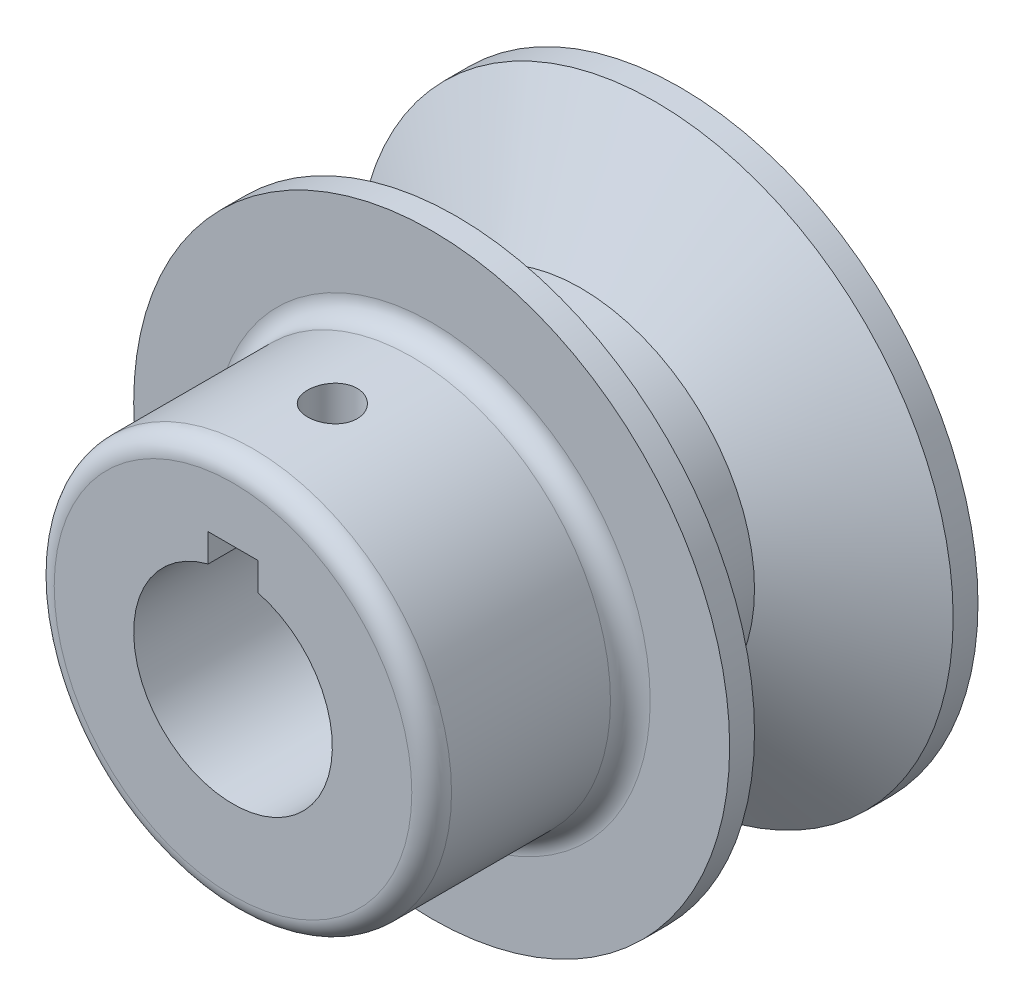
ISO-10303-21;
HEADER;
FILE_DESCRIPTION(('STEP AP214'),'2;1');
FILE_NAME('part.step','',(''),(''),'','','');
FILE_SCHEMA(('AUTOMOTIVE_DESIGN { 1 0 10303 214 1 1 1 1 }'));
ENDSEC;
DATA;
#1=APPLICATION_CONTEXT('core data for automotive mechanical design processes');
#2=APPLICATION_PROTOCOL_DEFINITION('international standard','automotive_design',2000,#1);
#3=PRODUCT_CONTEXT('',#1,'mechanical');
#4=PRODUCT('Part','Part','',(#3));
#5=PRODUCT_RELATED_PRODUCT_CATEGORY('part','',(#4));
#6=PRODUCT_DEFINITION_FORMATION('','',#4);
#7=PRODUCT_DEFINITION_CONTEXT('part definition',#1,'design');
#8=PRODUCT_DEFINITION('design','',#6,#7);
#9=PRODUCT_DEFINITION_SHAPE('','',#8);
#10=(LENGTH_UNIT() NAMED_UNIT(*) SI_UNIT(.MILLI.,.METRE.));
#11=(NAMED_UNIT(*) PLANE_ANGLE_UNIT() SI_UNIT($,.RADIAN.));
#12=(NAMED_UNIT(*) SI_UNIT($,.STERADIAN.) SOLID_ANGLE_UNIT());
#13=UNCERTAINTY_MEASURE_WITH_UNIT(LENGTH_MEASURE(1.E-05),#10,'distance_accuracy_value','');
#14=(GEOMETRIC_REPRESENTATION_CONTEXT(3) GLOBAL_UNCERTAINTY_ASSIGNED_CONTEXT((#13)) GLOBAL_UNIT_ASSIGNED_CONTEXT((#10,
#11,#12)) REPRESENTATION_CONTEXT('',''));
#15=CARTESIAN_POINT('',(0.,0.,0.));
#16=DIRECTION('',(0.,0.,1.));
#17=DIRECTION('',(1.,0.,0.));
#18=AXIS2_PLACEMENT_3D('',#15,#16,#17);
#19=CARTESIAN_POINT('',(0.,0.,0.));
#20=DIRECTION('',(0.,0.,1.));
#21=DIRECTION('',(1.,0.,0.));
#22=AXIS2_PLACEMENT_3D('',#19,#20,#21);
#23=CYLINDRICAL_SURFACE('',#22,12.7);
#24=CARTESIAN_POINT('',(0.,0.,-11.43));
#25=DIRECTION('',(0.,0.,-1.));
#26=DIRECTION('',(-1.,0.,0.));
#27=AXIS2_PLACEMENT_3D('',#24,#25,#26);
#28=CIRCLE('',#27,12.7);
#29=CARTESIAN_POINT('',(-12.7,0.,-11.43));
#30=VERTEX_POINT('',#29);
#31=EDGE_CURVE('E140',#30,#30,#28,.F.);
#32=ORIENTED_EDGE('',*,*,#31,.T.);
#33=EDGE_LOOP('',(#32));
#34=FACE_BOUND('',#33,.T.);
#35=CARTESIAN_POINT('',(0.,0.,-1.27));
#36=DIRECTION('',(0.,0.,-1.));
#37=DIRECTION('',(-1.,0.,0.));
#38=AXIS2_PLACEMENT_3D('',#35,#36,#37);
#39=CIRCLE('',#38,12.7);
#40=CARTESIAN_POINT('',(-12.7,0.,-1.27));
#41=VERTEX_POINT('',#40);
#42=EDGE_CURVE('E94',#41,#41,#39,.T.);
#43=ORIENTED_EDGE('',*,*,#42,.T.);
#44=EDGE_LOOP('',(#43));
#45=FACE_BOUND('',#44,.T.);
#46=CARTESIAN_POINT('',(0.,12.7,-7.9375));
#47=CARTESIAN_POINT('',(-0.0887990956779086,12.6999987610923,-7.93749622750582));
#48=CARTESIAN_POINT('',(-0.177653679682245,12.6990588319236,-7.93002422172751));
#49=CARTESIAN_POINT('',(-0.352890329326993,12.6953996797071,-7.90033487584755));
#50=CARTESIAN_POINT('',(-0.439269714946078,12.6926785988531,-7.87810213941865));
#51=CARTESIAN_POINT('',(-0.60699369000629,12.685763687632,-7.81955659611456));
#52=CARTESIAN_POINT('',(-0.688341625692798,12.6815708487427,-7.78325326645074));
#53=CARTESIAN_POINT('',(-0.843774966557078,12.6721787505759,-7.69761777467918));
#54=CARTESIAN_POINT('',(-0.917861614588296,12.6669796639841,-7.648287847583));
#55=CARTESIAN_POINT('',(-1.05709263875139,12.6561235402952,-7.53770911185186));
#56=CARTESIAN_POINT('',(-1.12219128173507,12.6504643782968,-7.47640292286514));
#57=CARTESIAN_POINT('',(-1.24120452390901,12.6393430601619,-7.34373510705423));
#58=CARTESIAN_POINT('',(-1.29511855300908,12.6338809140791,-7.27237296798009));
#59=CARTESIAN_POINT('',(-1.3904024524153,12.6237511406844,-7.1213218142458));
#60=CARTESIAN_POINT('',(-1.43172948092258,12.6190862500797,-7.04160557540436));
#61=CARTESIAN_POINT('',(-1.5003926536252,12.6111071657063,-6.87629622201343));
#62=CARTESIAN_POINT('',(-1.52772932837141,12.6077929207184,-6.79070333046165));
#63=CARTESIAN_POINT('',(-1.56749685231573,12.6029106564829,-6.6165449358024));
#64=CARTESIAN_POINT('',(-1.58000491385463,12.6013335948233,-6.52799732135784));
#65=CARTESIAN_POINT('',(-1.58999907396884,12.6000765787067,-6.35004682269539));
#66=CARTESIAN_POINT('',(-1.58748577663654,12.6003965479596,-6.26064397301563));
#67=CARTESIAN_POINT('',(-1.56757194514442,12.6028891665979,-6.08405893469702));
#68=CARTESIAN_POINT('',(-1.55025646449528,12.6050512310481,-5.99686698376283));
#69=CARTESIAN_POINT('',(-1.5013624933206,12.6109679184609,-5.82663616152594));
#70=CARTESIAN_POINT('',(-1.46978371381246,12.6147225736903,-5.74359737440658));
#71=CARTESIAN_POINT('',(-1.3931681305439,12.6234133857405,-5.58376582062123));
#72=CARTESIAN_POINT('',(-1.34809436610435,12.6283527798927,-5.50699095434189));
#73=CARTESIAN_POINT('',(-1.24579473310514,12.6388540175843,-5.36206274904759));
#74=CARTESIAN_POINT('',(-1.18856830871129,12.644415889589,-5.29390980460671));
#75=CARTESIAN_POINT('',(-1.06311643532865,12.6555824478042,-5.16766637869106));
#76=CARTESIAN_POINT('',(-0.994817674978408,12.6611871641568,-5.1096487267286));
#77=CARTESIAN_POINT('',(-0.849412302387342,12.6717719167297,-5.0058898611806));
#78=CARTESIAN_POINT('',(-0.77230566983709,12.6767519515096,-4.96014867590328));
#79=CARTESIAN_POINT('',(-0.61141716131581,12.685529316588,-4.88224111150541));
#80=CARTESIAN_POINT('',(-0.52763305403945,12.6893262494498,-4.85007929278542));
#81=CARTESIAN_POINT('',(-0.355795542173721,12.6953059897034,-4.80030123661273));
#82=CARTESIAN_POINT('',(-0.267742337660474,12.6974888726618,-4.78268431819297));
#83=CARTESIAN_POINT('',(-0.0904958590850711,12.6999847372083,-4.76259053559455));
#84=CARTESIAN_POINT('',(-0.00131412627611589,12.7003101095057,-4.76001334484882));
#85=CARTESIAN_POINT('',(0.17620998317591,12.6990877463345,-4.76980741112553));
#86=CARTESIAN_POINT('',(0.264552377653589,12.6975400507556,-4.78217834980476));
#87=CARTESIAN_POINT('',(0.437594062403167,12.692753181605,-4.82143416507173));
#88=CARTESIAN_POINT('',(0.522304372219688,12.6895195841681,-4.84827120476067));
#89=CARTESIAN_POINT('',(0.686022030835089,12.6817229416863,-4.9156476819647));
#90=CARTESIAN_POINT('',(0.765029185880475,12.677159851501,-4.95618758474205));
#91=CARTESIAN_POINT('',(0.915545870636516,12.6671820754792,-5.05006174231724));
#92=CARTESIAN_POINT('',(0.987014637564325,12.6617631196699,-5.10346089402658));
#93=CARTESIAN_POINT('',(1.12001108841271,12.6506931537679,-5.22144593093422));
#94=CARTESIAN_POINT('',(1.18153837754391,12.6450421344708,-5.28603226017938));
#95=CARTESIAN_POINT('',(1.29326129384944,12.6341067196874,-5.42500020964078));
#96=CARTESIAN_POINT('',(1.34339041746064,12.6288245944804,-5.4994354999071));
#97=CARTESIAN_POINT('',(1.43043458479663,12.6192623600859,-5.65572798548274));
#98=CARTESIAN_POINT('',(1.46734989341751,12.614982230812,-5.73758503196759));
#99=CARTESIAN_POINT('',(1.52681087758025,12.6079240499955,-5.90618282765873));
#100=CARTESIAN_POINT('',(1.54939404843526,12.6051420819234,-5.99291018208046));
#101=CARTESIAN_POINT('',(1.57967044610608,12.6013839660123,-6.16896307720072));
#102=CARTESIAN_POINT('',(1.58736436561021,12.6004077341657,-6.25828849683397));
#103=CARTESIAN_POINT('',(1.58763115041387,12.6003740688386,-6.43634027004497));
#104=CARTESIAN_POINT('',(1.58030849653904,12.6013033771749,-6.52506648269075));
#105=CARTESIAN_POINT('',(1.55097124707932,12.6049475773112,-6.70001652713412));
#106=CARTESIAN_POINT('',(1.52895664992016,12.6076624693026,-6.78624035866358));
#107=CARTESIAN_POINT('',(1.47089309179293,12.6145678351684,-6.95372431754666));
#108=CARTESIAN_POINT('',(1.43484916291654,12.6187577799142,-7.03498621258885));
#109=CARTESIAN_POINT('',(1.34976038286545,12.6281420236046,-7.19032512532068));
#110=CARTESIAN_POINT('',(1.30071536878859,12.6333363351336,-7.26440205296759));
#111=CARTESIAN_POINT('',(1.19062902035381,12.6441873401767,-7.4038023280912));
#112=CARTESIAN_POINT('',(1.1295098223671,12.6498468877336,-7.46906396770641));
#113=CARTESIAN_POINT('',(0.997172394124923,12.6609654806149,-7.58844483398166));
#114=CARTESIAN_POINT('',(0.925951786104895,12.66642447835,-7.64256142984169));
#115=CARTESIAN_POINT('',(0.775122669242424,12.6765498093258,-7.73829120176186));
#116=CARTESIAN_POINT('',(0.695483292543568,12.6812130492472,-7.77985604674603));
#117=CARTESIAN_POINT('',(0.530341142961313,12.6891900716372,-7.84896273925184));
#118=CARTESIAN_POINT('',(0.4448448563526,12.6925053195968,-7.87651982373445));
#119=CARTESIAN_POINT('',(0.299088665199632,12.6966136740812,-7.91023267973878));
#120=CARTESIAN_POINT('',(0.239747846333245,12.6978773594361,-7.92044322815861));
#121=CARTESIAN_POINT('',(0.120279835139896,12.6995709389403,-7.9340781410152));
#122=CARTESIAN_POINT('',(0.0601526486149773,12.700000839238,-7.93750255549356));
#123=CARTESIAN_POINT('',(0.,12.7,-7.9375));
#124=B_SPLINE_CURVE_WITH_KNOTS('',3,(#46,#47,#48,#49,#50,#51,#52,#53,#54,#55,#56,#57,#58,#59,
#60,#61,#62,#63,#64,#65,#66,#67,#68,#69,#70,#71,#72,#73,#74,#75,#76,#77,#78,#79,#80,#81,#82,#83,
#84,#85,#86,#87,#88,#89,#90,#91,#92,#93,#94,#95,#96,#97,#98,#99,#100,#101,#102,#103,#104,#105,
#106,#107,#108,#109,#110,#111,#112,#113,#114,#115,#116,#117,#118,#119,#120,#121,#122,#123),
.UNSPECIFIED.,.T.,.F.,(4,2,2,2,2,2,2,2,2,2,2,2,2,2,2,2,2,2,2,2,2,2,2,2,2,2,2,2,2,2,2,2,2,2,2,2,
2,2,4),(0.,0.266177568212917,0.532633212699076,0.798909697695424,1.06514052650331,
1.3326796638317,1.60023243453007,1.86868593952482,2.13712926330472,2.40416858056814,
2.67119715876762,2.93670162240475,3.20221146555563,3.46845525691314,3.73471122826161,
4.00280808616625,4.27090556226827,4.53909300289569,4.80726788673901,5.0736517741387,
5.34002998858725,5.60553269222306,5.87104441155132,6.13792525859548,6.40481670123181,
6.67322751907309,6.94163295580677,7.20933327168387,7.47702113311746,7.74285282263406,
8.00868454063513,8.2744209968862,8.54016078294288,8.80767375934312,9.07524981028459,
9.34384340928402,9.61214421664361,9.79245465424144,9.97276376220778),.UNSPECIFIED.);
#125=CARTESIAN_POINT('',(0.,12.7,-7.9375));
#126=VERTEX_POINT('',#125);
#127=EDGE_CURVE('E160',#126,#126,#124,.T.);
#128=ORIENTED_EDGE('',*,*,#127,.F.);
#129=EDGE_LOOP('',(#128));
#130=FACE_BOUND('',#129,.T.);
#131=ADVANCED_FACE('F33',(#34,#45,#130),#23,.T.);
#132=CARTESIAN_POINT('',(1.5875,7.9375,-28.575));
#133=DIRECTION('',(0.,1.,0.));
#134=DIRECTION('',(0.,0.,1.));
#135=AXIS2_PLACEMENT_3D('',#132,#133,#134);
#136=PLANE('',#135);
#137=CARTESIAN_POINT('',(0.,7.9375,-6.35));
#138=DIRECTION('',(0.,1.,0.));
#139=DIRECTION('',(0.,0.,1.));
#140=AXIS2_PLACEMENT_3D('',#137,#138,#139);
#141=CIRCLE('',#140,1.5875);
#142=CARTESIAN_POINT('',(-1.5875,7.9375,-6.35));
#143=VERTEX_POINT('',#142);
#144=CARTESIAN_POINT('',(1.5875,7.9375,-6.35));
#145=VERTEX_POINT('',#144);
#146=EDGE_CURVE('E47',#143,#145,#141,.F.);
#147=ORIENTED_EDGE('',*,*,#146,.F.);
#148=DIRECTION('',(0.,0.,1.));
#149=VECTOR('',#148,1.);
#150=CARTESIAN_POINT('',(-1.5875,7.9375,-28.575));
#151=LINE('',#150,#149);
#152=CARTESIAN_POINT('',(-1.5875,7.9375,-28.575));
#153=VERTEX_POINT('',#152);
#154=EDGE_CURVE('E91',#153,#143,#151,.T.);
#155=ORIENTED_EDGE('',*,*,#154,.F.);
#156=DIRECTION('',(-1.,0.,0.));
#157=VECTOR('',#156,1.);
#158=CARTESIAN_POINT('',(1.5875,7.9375,-28.575));
#159=LINE('',#158,#157);
#160=CARTESIAN_POINT('',(1.5875,7.9375,-28.575));
#161=VERTEX_POINT('',#160);
#162=EDGE_CURVE('E226',#161,#153,#159,.T.);
#163=ORIENTED_EDGE('',*,*,#162,.F.);
#164=DIRECTION('',(0.,0.,1.));
#165=VECTOR('',#164,1.);
#166=CARTESIAN_POINT('',(1.5875,7.9375,-28.575));
#167=LINE('',#166,#165);
#168=EDGE_CURVE('E93',#161,#145,#167,.T.);
#169=ORIENTED_EDGE('',*,*,#168,.T.);
#170=EDGE_LOOP('',(#147,#155,#163,#169));
#171=FACE_BOUND('',#170,.T.);
#172=ADVANCED_FACE('F88',(#171),#136,.F.);
#173=EDGE_CURVE('E78',#145,#143,#141,.F.);
#174=ORIENTED_EDGE('',*,*,#173,.F.);
#175=CARTESIAN_POINT('',(1.5875,7.9375,0.));
#176=VERTEX_POINT('',#175);
#177=EDGE_CURVE('E114',#145,#176,#167,.T.);
#178=ORIENTED_EDGE('',*,*,#177,.T.);
#179=DIRECTION('',(-1.,0.,0.));
#180=VECTOR('',#179,1.);
#181=CARTESIAN_POINT('',(1.5875,7.9375,0.));
#182=LINE('',#181,#180);
#183=CARTESIAN_POINT('',(-1.5875,7.9375,0.));
#184=VERTEX_POINT('',#183);
#185=EDGE_CURVE('E99',#176,#184,#182,.T.);
#186=ORIENTED_EDGE('',*,*,#185,.T.);
#187=EDGE_CURVE('E96',#143,#184,#151,.T.);
#188=ORIENTED_EDGE('',*,*,#187,.F.);
#189=EDGE_LOOP('',(#174,#178,#186,#188));
#190=FACE_BOUND('',#189,.T.);
#191=ADVANCED_FACE('F97',(#190),#136,.F.);
#192=CARTESIAN_POINT('',(0.,12.7,0.));
#193=DIRECTION('',(0.,0.,-1.));
#194=DIRECTION('',(-1.,0.,0.));
#195=AXIS2_PLACEMENT_3D('',#192,#193,#194);
#196=PLANE('',#195);
#197=CARTESIAN_POINT('',(0.,0.,0.));
#198=DIRECTION('',(0.,0.,-1.));
#199=DIRECTION('',(-1.,0.,0.));
#200=AXIS2_PLACEMENT_3D('',#197,#198,#199);
#201=CIRCLE('',#200,11.43);
#202=CARTESIAN_POINT('',(-11.43,0.,0.));
#203=VERTEX_POINT('',#202);
#204=EDGE_CURVE('E11',#203,#203,#201,.F.);
#205=ORIENTED_EDGE('',*,*,#204,.T.);
#206=EDGE_LOOP('',(#205));
#207=FACE_BOUND('',#206,.T.);
#208=ORIENTED_EDGE('',*,*,#185,.F.);
#209=DIRECTION('',(0.,1.,0.));
#210=VECTOR('',#209,1.);
#211=CARTESIAN_POINT('',(1.5875,4.7625,0.));
#212=LINE('',#211,#210);
#213=CARTESIAN_POINT('',(1.5875,6.14836106210427,0.));
#214=VERTEX_POINT('',#213);
#215=EDGE_CURVE('E161',#214,#176,#212,.T.);
#216=ORIENTED_EDGE('',*,*,#215,.F.);
#217=CARTESIAN_POINT('',(0.,0.,0.));
#218=DIRECTION('',(0.,0.,1.));
#219=DIRECTION('',(1.,0.,0.));
#220=AXIS2_PLACEMENT_3D('',#217,#218,#219);
#221=CIRCLE('',#220,6.35);
#222=CARTESIAN_POINT('',(-1.5875,6.14836106210427,0.));
#223=VERTEX_POINT('',#222);
#224=EDGE_CURVE('E107',#223,#214,#221,.T.);
#225=ORIENTED_EDGE('',*,*,#224,.F.);
#226=DIRECTION('',(0.,-1.,0.));
#227=VECTOR('',#226,1.);
#228=CARTESIAN_POINT('',(-1.5875,4.7625,0.));
#229=LINE('',#228,#227);
#230=EDGE_CURVE('E112',#184,#223,#229,.T.);
#231=ORIENTED_EDGE('',*,*,#230,.F.);
#232=EDGE_LOOP('',(#208,#216,#225,#231));
#233=FACE_BOUND('',#232,.T.);
#234=ADVANCED_FACE('F213',(#207,#233),#196,.F.);
#235=CARTESIAN_POINT('',(0.,19.05,-12.7));
#236=DIRECTION('',(0.,0.,-1.));
#237=DIRECTION('',(-1.,0.,0.));
#238=AXIS2_PLACEMENT_3D('',#235,#236,#237);
#239=PLANE('',#238);
#240=CARTESIAN_POINT('',(0.,0.,-12.7));
#241=DIRECTION('',(0.,0.,-1.));
#242=DIRECTION('',(-1.,0.,0.));
#243=AXIS2_PLACEMENT_3D('',#240,#241,#242);
#244=CIRCLE('',#243,13.97);
#245=CARTESIAN_POINT('',(-13.97,0.,-12.7));
#246=VERTEX_POINT('',#245);
#247=EDGE_CURVE('E41',#246,#246,#244,.T.);
#248=ORIENTED_EDGE('',*,*,#247,.T.);
#249=EDGE_LOOP('',(#248));
#250=FACE_BOUND('',#249,.T.);
#251=CARTESIAN_POINT('',(0.,0.,-12.7));
#252=DIRECTION('',(0.,0.,1.));
#253=DIRECTION('',(1.,0.,0.));
#254=AXIS2_PLACEMENT_3D('',#251,#252,#253);
#255=CIRCLE('',#254,19.05);
#256=CARTESIAN_POINT('',(19.05,0.,-12.7));
#257=VERTEX_POINT('',#256);
#258=EDGE_CURVE('E133',#257,#257,#255,.T.);
#259=ORIENTED_EDGE('',*,*,#258,.T.);
#260=EDGE_LOOP('',(#259));
#261=FACE_BOUND('',#260,.T.);
#262=ADVANCED_FACE('F145',(#250,#261),#239,.F.);
#263=CARTESIAN_POINT('',(0.,0.,0.));
#264=DIRECTION('',(0.,0.,1.));
#265=DIRECTION('',(1.,0.,0.));
#266=AXIS2_PLACEMENT_3D('',#263,#264,#265);
#267=CYLINDRICAL_SURFACE('',#266,19.05);
#268=ORIENTED_EDGE('',*,*,#258,.F.);
#269=EDGE_LOOP('',(#268));
#270=FACE_BOUND('',#269,.T.);
#271=CARTESIAN_POINT('',(0.,0.,-14.2875));
#272=DIRECTION('',(0.,0.,1.));
#273=DIRECTION('',(1.,0.,0.));
#274=AXIS2_PLACEMENT_3D('',#271,#272,#273);
#275=CIRCLE('',#274,19.05);
#276=CARTESIAN_POINT('',(19.05,0.,-14.2875));
#277=VERTEX_POINT('',#276);
#278=EDGE_CURVE('E130',#277,#277,#275,.T.);
#279=ORIENTED_EDGE('',*,*,#278,.T.);
#280=EDGE_LOOP('',(#279));
#281=FACE_BOUND('',#280,.T.);
#282=ADVANCED_FACE('F208',(#270,#281),#267,.T.);
#283=CARTESIAN_POINT('',(0.,0.,-19.05));
#284=DIRECTION('',(0.,0.,1.));
#285=DIRECTION('',(1.,0.,0.));
#286=AXIS2_PLACEMENT_3D('',#283,#284,#285);
#287=CONICAL_SURFACE('',#286,11.1125,1.03037682652431);
#288=ORIENTED_EDGE('',*,*,#278,.F.);
#289=EDGE_LOOP('',(#288));
#290=FACE_BOUND('',#289,.T.);
#291=CARTESIAN_POINT('',(0.,0.,-19.05));
#292=DIRECTION('',(0.,0.,1.));
#293=DIRECTION('',(1.,0.,0.));
#294=AXIS2_PLACEMENT_3D('',#291,#292,#293);
#295=CIRCLE('',#294,11.1125);
#296=CARTESIAN_POINT('',(11.1125,0.,-19.05));
#297=VERTEX_POINT('',#296);
#298=EDGE_CURVE('E127',#297,#297,#295,.T.);
#299=ORIENTED_EDGE('',*,*,#298,.T.);
#300=EDGE_LOOP('',(#299));
#301=FACE_BOUND('',#300,.T.);
#302=ADVANCED_FACE('F204',(#290,#301),#287,.T.);
#303=CARTESIAN_POINT('',(0.,0.,0.));
#304=DIRECTION('',(0.,0.,1.));
#305=DIRECTION('',(1.,0.,0.));
#306=AXIS2_PLACEMENT_3D('',#303,#304,#305);
#307=CYLINDRICAL_SURFACE('',#306,11.1125);
#308=ORIENTED_EDGE('',*,*,#298,.F.);
#309=EDGE_LOOP('',(#308));
#310=FACE_BOUND('',#309,.T.);
#311=CARTESIAN_POINT('',(0.,0.,-22.225));
#312=DIRECTION('',(0.,0.,1.));
#313=DIRECTION('',(1.,0.,0.));
#314=AXIS2_PLACEMENT_3D('',#311,#312,#313);
#315=CIRCLE('',#314,11.1125);
#316=CARTESIAN_POINT('',(11.1125,0.,-22.225));
#317=VERTEX_POINT('',#316);
#318=EDGE_CURVE('E124',#317,#317,#315,.T.);
#319=ORIENTED_EDGE('',*,*,#318,.T.);
#320=EDGE_LOOP('',(#319));
#321=FACE_BOUND('',#320,.T.);
#322=ADVANCED_FACE('F200',(#310,#321),#307,.T.);
#323=CARTESIAN_POINT('',(0.,0.,-26.9875));
#324=DIRECTION('',(0.,0.,-1.));
#325=DIRECTION('',(-1.,0.,0.));
#326=AXIS2_PLACEMENT_3D('',#323,#324,#325);
#327=CONICAL_SURFACE('',#326,19.05,1.03037682652431);
#328=ORIENTED_EDGE('',*,*,#318,.F.);
#329=EDGE_LOOP('',(#328));
#330=FACE_BOUND('',#329,.T.);
#331=CARTESIAN_POINT('',(0.,0.,-26.9875));
#332=DIRECTION('',(0.,0.,1.));
#333=DIRECTION('',(1.,0.,0.));
#334=AXIS2_PLACEMENT_3D('',#331,#332,#333);
#335=CIRCLE('',#334,19.05);
#336=CARTESIAN_POINT('',(19.05,0.,-26.9875));
#337=VERTEX_POINT('',#336);
#338=EDGE_CURVE('E121',#337,#337,#335,.T.);
#339=ORIENTED_EDGE('',*,*,#338,.T.);
#340=EDGE_LOOP('',(#339));
#341=FACE_BOUND('',#340,.T.);
#342=ADVANCED_FACE('F196',(#330,#341),#327,.T.);
#343=CARTESIAN_POINT('',(0.,0.,0.));
#344=DIRECTION('',(0.,0.,1.));
#345=DIRECTION('',(1.,0.,0.));
#346=AXIS2_PLACEMENT_3D('',#343,#344,#345);
#347=CYLINDRICAL_SURFACE('',#346,19.05);
#348=ORIENTED_EDGE('',*,*,#338,.F.);
#349=EDGE_LOOP('',(#348));
#350=FACE_BOUND('',#349,.T.);
#351=CARTESIAN_POINT('',(0.,0.,-28.575));
#352=DIRECTION('',(0.,0.,1.));
#353=DIRECTION('',(1.,0.,0.));
#354=AXIS2_PLACEMENT_3D('',#351,#352,#353);
#355=CIRCLE('',#354,19.05);
#356=CARTESIAN_POINT('',(19.05,0.,-28.575));
#357=VERTEX_POINT('',#356);
#358=EDGE_CURVE('E118',#357,#357,#355,.T.);
#359=ORIENTED_EDGE('',*,*,#358,.T.);
#360=EDGE_LOOP('',(#359));
#361=FACE_BOUND('',#360,.T.);
#362=ADVANCED_FACE('F192',(#350,#361),#347,.T.);
#363=CARTESIAN_POINT('',(0.,6.35,-28.575));
#364=DIRECTION('',(0.,0.,1.));
#365=DIRECTION('',(1.,0.,0.));
#366=AXIS2_PLACEMENT_3D('',#363,#364,#365);
#367=PLANE('',#366);
#368=CARTESIAN_POINT('',(0.,0.,-28.575));
#369=DIRECTION('',(0.,0.,1.));
#370=DIRECTION('',(1.,0.,0.));
#371=AXIS2_PLACEMENT_3D('',#368,#369,#370);
#372=CIRCLE('',#371,6.35);
#373=CARTESIAN_POINT('',(-1.5875,6.14836106210427,-28.575));
#374=VERTEX_POINT('',#373);
#375=CARTESIAN_POINT('',(1.5875,6.14836106210427,-28.575));
#376=VERTEX_POINT('',#375);
#377=EDGE_CURVE('E108',#374,#376,#372,.T.);
#378=ORIENTED_EDGE('',*,*,#377,.T.);
#379=DIRECTION('',(0.,1.,0.));
#380=VECTOR('',#379,1.);
#381=CARTESIAN_POINT('',(1.5875,4.7625,-28.575));
#382=LINE('',#381,#380);
#383=EDGE_CURVE('E170',#376,#161,#382,.T.);
#384=ORIENTED_EDGE('',*,*,#383,.T.);
#385=ORIENTED_EDGE('',*,*,#162,.T.);
#386=DIRECTION('',(0.,-1.,0.));
#387=VECTOR('',#386,1.);
#388=CARTESIAN_POINT('',(-1.5875,4.7625,-28.575));
#389=LINE('',#388,#387);
#390=EDGE_CURVE('E105',#153,#374,#389,.T.);
#391=ORIENTED_EDGE('',*,*,#390,.T.);
#392=EDGE_LOOP('',(#378,#384,#385,#391));
#393=FACE_BOUND('',#392,.T.);
#394=ORIENTED_EDGE('',*,*,#358,.F.);
#395=EDGE_LOOP('',(#394));
#396=FACE_BOUND('',#395,.T.);
#397=ADVANCED_FACE('F189',(#393,#396),#367,.F.);
#398=CARTESIAN_POINT('',(0.,0.,0.));
#399=DIRECTION('',(0.,0.,1.));
#400=DIRECTION('',(1.,0.,0.));
#401=AXIS2_PLACEMENT_3D('',#398,#399,#400);
#402=CYLINDRICAL_SURFACE('',#401,6.35);
#403=ORIENTED_EDGE('',*,*,#224,.T.);
#404=DIRECTION('',(0.,0.,1.));
#405=VECTOR('',#404,1.);
#406=CARTESIAN_POINT('',(1.5875,6.14836106210427,0.));
#407=LINE('',#406,#405);
#408=EDGE_CURVE('E84',#214,#376,#407,.F.);
#409=ORIENTED_EDGE('',*,*,#408,.T.);
#410=ORIENTED_EDGE('',*,*,#377,.F.);
#411=DIRECTION('',(0.,0.,1.));
#412=VECTOR('',#411,1.);
#413=CARTESIAN_POINT('',(-1.5875,6.14836106210427,0.));
#414=LINE('',#413,#412);
#415=EDGE_CURVE('E55',#374,#223,#414,.T.);
#416=ORIENTED_EDGE('',*,*,#415,.T.);
#417=EDGE_LOOP('',(#403,#409,#410,#416));
#418=FACE_BOUND('',#417,.T.);
#419=ADVANCED_FACE('F185',(#418),#402,.F.);
#420=CARTESIAN_POINT('',(1.5875,4.7625,-28.575));
#421=DIRECTION('',(1.,0.,0.));
#422=DIRECTION('',(0.,0.,-1.));
#423=AXIS2_PLACEMENT_3D('',#420,#421,#422);
#424=PLANE('',#423);
#425=ORIENTED_EDGE('',*,*,#383,.F.);
#426=ORIENTED_EDGE('',*,*,#408,.F.);
#427=ORIENTED_EDGE('',*,*,#215,.T.);
#428=ORIENTED_EDGE('',*,*,#177,.F.);
#429=ORIENTED_EDGE('',*,*,#168,.F.);
#430=EDGE_LOOP('',(#425,#426,#427,#428,#429));
#431=FACE_BOUND('',#430,.T.);
#432=ADVANCED_FACE('F180',(#431),#424,.F.);
#433=CARTESIAN_POINT('',(-1.5875,4.7625,-28.575));
#434=DIRECTION('',(-1.,0.,0.));
#435=DIRECTION('',(0.,-1.,0.));
#436=AXIS2_PLACEMENT_3D('',#433,#434,#435);
#437=PLANE('',#436);
#438=ORIENTED_EDGE('',*,*,#230,.T.);
#439=ORIENTED_EDGE('',*,*,#415,.F.);
#440=ORIENTED_EDGE('',*,*,#390,.F.);
#441=ORIENTED_EDGE('',*,*,#154,.T.);
#442=ORIENTED_EDGE('',*,*,#187,.T.);
#443=EDGE_LOOP('',(#438,#439,#440,#441,#442));
#444=FACE_BOUND('',#443,.T.);
#445=ADVANCED_FACE('F103',(#444),#437,.F.);
#446=CARTESIAN_POINT('',(0.,19.05,-6.35));
#447=DIRECTION('',(0.,-1.,0.));
#448=DIRECTION('',(0.,0.,-1.));
#449=AXIS2_PLACEMENT_3D('',#446,#447,#448);
#450=CYLINDRICAL_SURFACE('',#449,1.5875);
#451=ORIENTED_EDGE('',*,*,#146,.T.);
#452=ORIENTED_EDGE('',*,*,#173,.T.);
#453=EDGE_LOOP('',(#451,#452));
#454=FACE_BOUND('',#453,.T.);
#455=ORIENTED_EDGE('',*,*,#127,.T.);
#456=EDGE_LOOP('',(#455));
#457=FACE_BOUND('',#456,.T.);
#458=ADVANCED_FACE('F79',(#454,#457),#450,.F.);
#459=CARTESIAN_POINT('',(0.,0.,-11.43));
#460=DIRECTION('',(0.,0.,-1.));
#461=DIRECTION('',(-1.,0.,0.));
#462=AXIS2_PLACEMENT_3D('',#459,#460,#461);
#463=TOROIDAL_SURFACE('',#462,13.97,1.27);
#464=ORIENTED_EDGE('',*,*,#247,.F.);
#465=EDGE_LOOP('',(#464));
#466=FACE_BOUND('',#465,.T.);
#467=ORIENTED_EDGE('',*,*,#31,.F.);
#468=EDGE_LOOP('',(#467));
#469=FACE_BOUND('',#468,.T.);
#470=ADVANCED_FACE('F148',(#466,#469),#463,.F.);
#471=CARTESIAN_POINT('',(0.,0.,-1.27));
#472=DIRECTION('',(0.,0.,-1.));
#473=DIRECTION('',(-1.,0.,0.));
#474=AXIS2_PLACEMENT_3D('',#471,#472,#473);
#475=TOROIDAL_SURFACE('',#474,11.43,1.27);
#476=ORIENTED_EDGE('',*,*,#42,.F.);
#477=EDGE_LOOP('',(#476));
#478=FACE_BOUND('',#477,.T.);
#479=ORIENTED_EDGE('',*,*,#204,.F.);
#480=EDGE_LOOP('',(#479));
#481=FACE_BOUND('',#480,.T.);
#482=ADVANCED_FACE('F35',(#478,#481),#475,.T.);
#483=CLOSED_SHELL('',(#131,#172,#191,#234,#262,#282,#302,#322,#342,#362,#397,#419,#432,#445,
#458,#470,#482));
#484=MANIFOLD_SOLID_BREP('B2',#483);
#485=ADVANCED_BREP_SHAPE_REPRESENTATION('',(#18,#484),#14);
#486=SHAPE_DEFINITION_REPRESENTATION(#9,#485);
ENDSEC;
END-ISO-10303-21;
